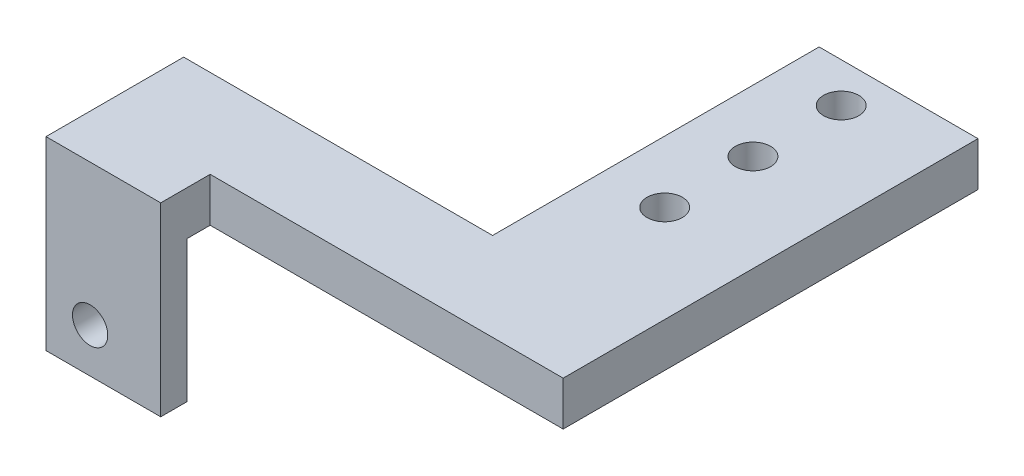
ISO-10303-21;
HEADER;
FILE_DESCRIPTION(('STEP AP214'),'2;1');
FILE_NAME('part.step','',(''),(''),'','','');
FILE_SCHEMA(('AUTOMOTIVE_DESIGN { 1 0 10303 214 1 1 1 1 }'));
ENDSEC;
DATA;
#1=APPLICATION_CONTEXT('core data for automotive mechanical design processes');
#2=APPLICATION_PROTOCOL_DEFINITION('international standard','automotive_design',2000,#1);
#3=PRODUCT_CONTEXT('',#1,'mechanical');
#4=PRODUCT('Part','Part','',(#3));
#5=PRODUCT_RELATED_PRODUCT_CATEGORY('part','',(#4));
#6=PRODUCT_DEFINITION_FORMATION('','',#4);
#7=PRODUCT_DEFINITION_CONTEXT('part definition',#1,'design');
#8=PRODUCT_DEFINITION('design','',#6,#7);
#9=PRODUCT_DEFINITION_SHAPE('','',#8);
#10=(LENGTH_UNIT() NAMED_UNIT(*) SI_UNIT(.MILLI.,.METRE.));
#11=(NAMED_UNIT(*) PLANE_ANGLE_UNIT() SI_UNIT($,.RADIAN.));
#12=(NAMED_UNIT(*) SI_UNIT($,.STERADIAN.) SOLID_ANGLE_UNIT());
#13=UNCERTAINTY_MEASURE_WITH_UNIT(LENGTH_MEASURE(1.E-05),#10,'distance_accuracy_value','');
#14=(GEOMETRIC_REPRESENTATION_CONTEXT(3) GLOBAL_UNCERTAINTY_ASSIGNED_CONTEXT((#13)) GLOBAL_UNIT_ASSIGNED_CONTEXT((#10,
#11,#12)) REPRESENTATION_CONTEXT('',''));
#15=CARTESIAN_POINT('',(0.,0.,0.));
#16=DIRECTION('',(0.,0.,1.));
#17=DIRECTION('',(1.,0.,0.));
#18=AXIS2_PLACEMENT_3D('',#15,#16,#17);
#19=CARTESIAN_POINT('',(0.,0.,0.));
#20=DIRECTION('',(0.,1.,0.));
#21=DIRECTION('',(0.,0.,1.));
#22=AXIS2_PLACEMENT_3D('',#19,#20,#21);
#23=PLANE('',#22);
#24=CARTESIAN_POINT('',(16.5,0.,-31.3394531545482));
#25=DIRECTION('',(0.,1.,0.));
#26=DIRECTION('',(0.,0.,1.));
#27=AXIS2_PLACEMENT_3D('',#24,#25,#26);
#28=CIRCLE('',#27,2.);
#29=CARTESIAN_POINT('',(16.5,0.,-29.3394531545482));
#30=VERTEX_POINT('',#29);
#31=EDGE_CURVE('E244',#30,#30,#28,.T.);
#32=ORIENTED_EDGE('',*,*,#31,.T.);
#33=EDGE_LOOP('',(#32));
#34=FACE_BOUND('',#33,.T.);
#35=CARTESIAN_POINT('',(16.5,0.,-21.3394531545482));
#36=DIRECTION('',(0.,1.,0.));
#37=DIRECTION('',(0.,0.,1.));
#38=AXIS2_PLACEMENT_3D('',#35,#36,#37);
#39=CIRCLE('',#38,2.);
#40=CARTESIAN_POINT('',(16.5,0.,-19.3394531545482));
#41=VERTEX_POINT('',#40);
#42=EDGE_CURVE('E249',#41,#41,#39,.T.);
#43=ORIENTED_EDGE('',*,*,#42,.T.);
#44=EDGE_LOOP('',(#43));
#45=FACE_BOUND('',#44,.T.);
#46=CARTESIAN_POINT('',(16.5,0.,-11.3394531545482));
#47=DIRECTION('',(0.,1.,0.));
#48=DIRECTION('',(0.,0.,1.));
#49=AXIS2_PLACEMENT_3D('',#46,#47,#48);
#50=CIRCLE('',#49,2.);
#51=CARTESIAN_POINT('',(16.5,0.,-9.33945315454823));
#52=VERTEX_POINT('',#51);
#53=EDGE_CURVE('E255',#52,#52,#50,.T.);
#54=ORIENTED_EDGE('',*,*,#53,.T.);
#55=EDGE_LOOP('',(#54));
#56=FACE_BOUND('',#55,.T.);
#57=DIRECTION('',(1.,0.,0.));
#58=VECTOR('',#57,1.);
#59=CARTESIAN_POINT('',(-12.5,0.,13.7605468454518));
#60=LINE('',#59,#58);
#61=CARTESIAN_POINT('',(-25.5,0.,13.7605468454518));
#62=VERTEX_POINT('',#61);
#63=CARTESIAN_POINT('',(-12.5,0.,13.7605468454518));
#64=VERTEX_POINT('',#63);
#65=EDGE_CURVE('E55',#62,#64,#60,.T.);
#66=ORIENTED_EDGE('',*,*,#65,.F.);
#67=DIRECTION('',(0.,0.,1.));
#68=VECTOR('',#67,1.);
#69=CARTESIAN_POINT('',(-25.5,0.,16.7605468454518));
#70=LINE('',#69,#68);
#71=CARTESIAN_POINT('',(-25.5,0.,1.16054684545176));
#72=VERTEX_POINT('',#71);
#73=EDGE_CURVE('E158',#72,#62,#70,.T.);
#74=ORIENTED_EDGE('',*,*,#73,.F.);
#75=DIRECTION('',(-1.,0.,0.));
#76=VECTOR('',#75,1.);
#77=CARTESIAN_POINT('',(-25.5,0.,1.16054684545176));
#78=LINE('',#77,#76);
#79=CARTESIAN_POINT('',(9.49999999999998,0.,1.16054684545177));
#80=VERTEX_POINT('',#79);
#81=EDGE_CURVE('E155',#80,#72,#78,.T.);
#82=ORIENTED_EDGE('',*,*,#81,.F.);
#83=DIRECTION('',(0.,0.,1.));
#84=VECTOR('',#83,1.);
#85=CARTESIAN_POINT('',(9.49999999999998,0.,-35.8394531545482));
#86=LINE('',#85,#84);
#87=CARTESIAN_POINT('',(9.49999999999998,0.,-35.8394531545482));
#88=VERTEX_POINT('',#87);
#89=EDGE_CURVE('E151',#88,#80,#86,.T.);
#90=ORIENTED_EDGE('',*,*,#89,.F.);
#91=DIRECTION('',(-1.,0.,0.));
#92=VECTOR('',#91,1.);
#93=CARTESIAN_POINT('',(27.5,0.,-35.8394531545482));
#94=LINE('',#93,#92);
#95=CARTESIAN_POINT('',(27.5,0.,-35.8394531545482));
#96=VERTEX_POINT('',#95);
#97=EDGE_CURVE('E147',#96,#88,#94,.T.);
#98=ORIENTED_EDGE('',*,*,#97,.F.);
#99=DIRECTION('',(0.,0.,-1.));
#100=VECTOR('',#99,1.);
#101=CARTESIAN_POINT('',(27.5,0.,11.1605468454518));
#102=LINE('',#101,#100);
#103=CARTESIAN_POINT('',(27.5,0.,11.1605468454518));
#104=VERTEX_POINT('',#103);
#105=EDGE_CURVE('E91',#104,#96,#102,.T.);
#106=ORIENTED_EDGE('',*,*,#105,.F.);
#107=DIRECTION('',(1.,0.,0.));
#108=VECTOR('',#107,1.);
#109=CARTESIAN_POINT('',(27.5,0.,11.1605468454518));
#110=LINE('',#109,#108);
#111=CARTESIAN_POINT('',(-12.5,0.,11.1605468454518));
#112=VERTEX_POINT('',#111);
#113=EDGE_CURVE('E163',#112,#104,#110,.T.);
#114=ORIENTED_EDGE('',*,*,#113,.F.);
#115=DIRECTION('',(0.,0.,-1.));
#116=VECTOR('',#115,1.);
#117=CARTESIAN_POINT('',(-12.5,0.,11.1605468454518));
#118=LINE('',#117,#116);
#119=EDGE_CURVE('E132',#64,#112,#118,.T.);
#120=ORIENTED_EDGE('',*,*,#119,.F.);
#121=EDGE_LOOP('',(#66,#74,#82,#90,#98,#106,#114,#120));
#122=FACE_BOUND('',#121,.T.);
#123=ADVANCED_FACE('F39',(#34,#45,#56,#122),#23,.F.);
#124=CARTESIAN_POINT('',(27.5,5.,-35.8394531545482));
#125=DIRECTION('',(0.,0.,1.));
#126=DIRECTION('',(1.,0.,0.));
#127=AXIS2_PLACEMENT_3D('',#124,#125,#126);
#128=PLANE('',#127);
#129=ORIENTED_EDGE('',*,*,#97,.T.);
#130=DIRECTION('',(0.,-1.,0.));
#131=VECTOR('',#130,1.);
#132=CARTESIAN_POINT('',(9.49999999999998,5.,-35.8394531545482));
#133=LINE('',#132,#131);
#134=CARTESIAN_POINT('',(9.49999999999998,5.,-35.8394531545482));
#135=VERTEX_POINT('',#134);
#136=EDGE_CURVE('E11',#135,#88,#133,.T.);
#137=ORIENTED_EDGE('',*,*,#136,.F.);
#138=DIRECTION('',(-1.,0.,0.));
#139=VECTOR('',#138,1.);
#140=CARTESIAN_POINT('',(27.5,5.,-35.8394531545482));
#141=LINE('',#140,#139);
#142=CARTESIAN_POINT('',(27.5,5.,-35.8394531545482));
#143=VERTEX_POINT('',#142);
#144=EDGE_CURVE('E168',#143,#135,#141,.T.);
#145=ORIENTED_EDGE('',*,*,#144,.F.);
#146=DIRECTION('',(0.,-1.,0.));
#147=VECTOR('',#146,1.);
#148=CARTESIAN_POINT('',(27.5,5.,-35.8394531545482));
#149=LINE('',#148,#147);
#150=EDGE_CURVE('E143',#143,#96,#149,.T.);
#151=ORIENTED_EDGE('',*,*,#150,.T.);
#152=EDGE_LOOP('',(#129,#137,#145,#151));
#153=FACE_BOUND('',#152,.T.);
#154=ADVANCED_FACE('F41',(#153),#128,.F.);
#155=CARTESIAN_POINT('',(9.49999999999998,5.,-35.8394531545482));
#156=DIRECTION('',(1.,0.,0.));
#157=DIRECTION('',(0.,0.,-1.));
#158=AXIS2_PLACEMENT_3D('',#155,#156,#157);
#159=PLANE('',#158);
#160=ORIENTED_EDGE('',*,*,#89,.T.);
#161=DIRECTION('',(0.,-1.,0.));
#162=VECTOR('',#161,1.);
#163=CARTESIAN_POINT('',(9.49999999999998,5.,1.16054684545177));
#164=LINE('',#163,#162);
#165=CARTESIAN_POINT('',(9.49999999999998,5.,1.16054684545177));
#166=VERTEX_POINT('',#165);
#167=EDGE_CURVE('E48',#166,#80,#164,.T.);
#168=ORIENTED_EDGE('',*,*,#167,.F.);
#169=DIRECTION('',(0.,0.,1.));
#170=VECTOR('',#169,1.);
#171=CARTESIAN_POINT('',(9.49999999999998,5.,-35.8394531545482));
#172=LINE('',#171,#170);
#173=EDGE_CURVE('E99',#135,#166,#172,.T.);
#174=ORIENTED_EDGE('',*,*,#173,.F.);
#175=ORIENTED_EDGE('',*,*,#136,.T.);
#176=EDGE_LOOP('',(#160,#168,#174,#175));
#177=FACE_BOUND('',#176,.T.);
#178=ADVANCED_FACE('F302',(#177),#159,.F.);
#179=CARTESIAN_POINT('',(-25.5,5.,1.16054684545176));
#180=DIRECTION('',(0.,0.,1.));
#181=DIRECTION('',(1.,0.,0.));
#182=AXIS2_PLACEMENT_3D('',#179,#180,#181);
#183=PLANE('',#182);
#184=ORIENTED_EDGE('',*,*,#81,.T.);
#185=DIRECTION('',(0.,-1.,0.));
#186=VECTOR('',#185,1.);
#187=CARTESIAN_POINT('',(-25.5,5.,1.16054684545176));
#188=LINE('',#187,#186);
#189=CARTESIAN_POINT('',(-25.5,5.,1.16054684545176));
#190=VERTEX_POINT('',#189);
#191=EDGE_CURVE('E179',#190,#72,#188,.T.);
#192=ORIENTED_EDGE('',*,*,#191,.F.);
#193=DIRECTION('',(-1.,0.,0.));
#194=VECTOR('',#193,1.);
#195=CARTESIAN_POINT('',(-25.5,5.,1.16054684545176));
#196=LINE('',#195,#194);
#197=EDGE_CURVE('E189',#166,#190,#196,.T.);
#198=ORIENTED_EDGE('',*,*,#197,.F.);
#199=ORIENTED_EDGE('',*,*,#167,.T.);
#200=EDGE_LOOP('',(#184,#192,#198,#199));
#201=FACE_BOUND('',#200,.T.);
#202=ADVANCED_FACE('F187',(#201),#183,.F.);
#203=CARTESIAN_POINT('',(-25.5,5.,16.7605468454518));
#204=DIRECTION('',(1.,0.,0.));
#205=DIRECTION('',(0.,0.,-1.));
#206=AXIS2_PLACEMENT_3D('',#203,#204,#205);
#207=PLANE('',#206);
#208=ORIENTED_EDGE('',*,*,#73,.T.);
#209=DIRECTION('',(0.,1.,0.));
#210=VECTOR('',#209,1.);
#211=CARTESIAN_POINT('',(-25.5,-16.,13.7605468454518));
#212=LINE('',#211,#210);
#213=CARTESIAN_POINT('',(-25.5,-16.,13.7605468454518));
#214=VERTEX_POINT('',#213);
#215=EDGE_CURVE('E152',#214,#62,#212,.T.);
#216=ORIENTED_EDGE('',*,*,#215,.F.);
#217=DIRECTION('',(0.,0.,-1.));
#218=VECTOR('',#217,1.);
#219=CARTESIAN_POINT('',(-25.5,-16.,16.7605468454518));
#220=LINE('',#219,#218);
#221=CARTESIAN_POINT('',(-25.5,-16.,16.7605468454518));
#222=VERTEX_POINT('',#221);
#223=EDGE_CURVE('E223',#222,#214,#220,.T.);
#224=ORIENTED_EDGE('',*,*,#223,.F.);
#225=DIRECTION('',(0.,-1.,0.));
#226=VECTOR('',#225,1.);
#227=CARTESIAN_POINT('',(-25.5,5.,16.7605468454518));
#228=LINE('',#227,#226);
#229=CARTESIAN_POINT('',(-25.5,5.,16.7605468454518));
#230=VERTEX_POINT('',#229);
#231=EDGE_CURVE('E175',#230,#222,#228,.T.);
#232=ORIENTED_EDGE('',*,*,#231,.F.);
#233=DIRECTION('',(0.,0.,1.));
#234=VECTOR('',#233,1.);
#235=CARTESIAN_POINT('',(-25.5,5.,16.7605468454518));
#236=LINE('',#235,#234);
#237=EDGE_CURVE('E217',#190,#230,#236,.T.);
#238=ORIENTED_EDGE('',*,*,#237,.F.);
#239=ORIENTED_EDGE('',*,*,#191,.T.);
#240=EDGE_LOOP('',(#208,#216,#224,#232,#238,#239));
#241=FACE_BOUND('',#240,.T.);
#242=ADVANCED_FACE('F194',(#241),#207,.F.);
#243=CARTESIAN_POINT('',(-12.5,5.,16.7605468454518));
#244=DIRECTION('',(0.,0.,-1.));
#245=DIRECTION('',(-1.,0.,0.));
#246=AXIS2_PLACEMENT_3D('',#243,#244,#245);
#247=PLANE('',#246);
#248=CARTESIAN_POINT('',(-20.5,-11.,16.7605468454518));
#249=DIRECTION('',(0.,0.,-1.));
#250=DIRECTION('',(-1.,0.,0.));
#251=AXIS2_PLACEMENT_3D('',#248,#249,#250);
#252=CIRCLE('',#251,2.);
#253=CARTESIAN_POINT('',(-22.5,-11.,16.7605468454518));
#254=VERTEX_POINT('',#253);
#255=EDGE_CURVE('E268',#254,#254,#252,.T.);
#256=ORIENTED_EDGE('',*,*,#255,.T.);
#257=EDGE_LOOP('',(#256));
#258=FACE_BOUND('',#257,.T.);
#259=ORIENTED_EDGE('',*,*,#231,.T.);
#260=DIRECTION('',(-1.,0.,0.));
#261=VECTOR('',#260,1.);
#262=CARTESIAN_POINT('',(-12.5,-16.,16.7605468454518));
#263=LINE('',#262,#261);
#264=CARTESIAN_POINT('',(-12.5,-16.,16.7605468454518));
#265=VERTEX_POINT('',#264);
#266=EDGE_CURVE('E229',#265,#222,#263,.T.);
#267=ORIENTED_EDGE('',*,*,#266,.F.);
#268=DIRECTION('',(0.,-1.,0.));
#269=VECTOR('',#268,1.);
#270=CARTESIAN_POINT('',(-12.5,5.,16.7605468454518));
#271=LINE('',#270,#269);
#272=CARTESIAN_POINT('',(-12.5,5.,16.7605468454518));
#273=VERTEX_POINT('',#272);
#274=EDGE_CURVE('E136',#273,#265,#271,.T.);
#275=ORIENTED_EDGE('',*,*,#274,.F.);
#276=DIRECTION('',(1.,0.,0.));
#277=VECTOR('',#276,1.);
#278=CARTESIAN_POINT('',(-12.5,5.,16.7605468454518));
#279=LINE('',#278,#277);
#280=EDGE_CURVE('E122',#230,#273,#279,.T.);
#281=ORIENTED_EDGE('',*,*,#280,.F.);
#282=EDGE_LOOP('',(#259,#267,#275,#281));
#283=FACE_BOUND('',#282,.T.);
#284=ADVANCED_FACE('F227',(#258,#283),#247,.F.);
#285=CARTESIAN_POINT('',(-12.5,5.,11.1605468454518));
#286=DIRECTION('',(-1.,0.,0.));
#287=DIRECTION('',(0.,0.,1.));
#288=AXIS2_PLACEMENT_3D('',#285,#286,#287);
#289=PLANE('',#288);
#290=ORIENTED_EDGE('',*,*,#274,.T.);
#291=DIRECTION('',(0.,0.,1.));
#292=VECTOR('',#291,1.);
#293=CARTESIAN_POINT('',(-12.5,-16.,16.7605468454518));
#294=LINE('',#293,#292);
#295=CARTESIAN_POINT('',(-12.5,-16.,13.7605468454518));
#296=VERTEX_POINT('',#295);
#297=EDGE_CURVE('E232',#296,#265,#294,.T.);
#298=ORIENTED_EDGE('',*,*,#297,.F.);
#299=DIRECTION('',(0.,1.,0.));
#300=VECTOR('',#299,1.);
#301=CARTESIAN_POINT('',(-12.5,-16.,13.7605468454518));
#302=LINE('',#301,#300);
#303=EDGE_CURVE('E205',#296,#64,#302,.T.);
#304=ORIENTED_EDGE('',*,*,#303,.T.);
#305=ORIENTED_EDGE('',*,*,#119,.T.);
#306=DIRECTION('',(0.,-1.,0.));
#307=VECTOR('',#306,1.);
#308=CARTESIAN_POINT('',(-12.5,5.,11.1605468454518));
#309=LINE('',#308,#307);
#310=CARTESIAN_POINT('',(-12.5,5.,11.1605468454518));
#311=VERTEX_POINT('',#310);
#312=EDGE_CURVE('E129',#311,#112,#309,.T.);
#313=ORIENTED_EDGE('',*,*,#312,.F.);
#314=DIRECTION('',(0.,0.,-1.));
#315=VECTOR('',#314,1.);
#316=CARTESIAN_POINT('',(-12.5,5.,11.1605468454518));
#317=LINE('',#316,#315);
#318=EDGE_CURVE('E115',#273,#311,#317,.T.);
#319=ORIENTED_EDGE('',*,*,#318,.F.);
#320=EDGE_LOOP('',(#290,#298,#304,#305,#313,#319));
#321=FACE_BOUND('',#320,.T.);
#322=ADVANCED_FACE('F130',(#321),#289,.F.);
#323=CARTESIAN_POINT('',(27.5,5.,11.1605468454518));
#324=DIRECTION('',(0.,0.,-1.));
#325=DIRECTION('',(-1.,0.,0.));
#326=AXIS2_PLACEMENT_3D('',#323,#324,#325);
#327=PLANE('',#326);
#328=ORIENTED_EDGE('',*,*,#113,.T.);
#329=DIRECTION('',(0.,-1.,0.));
#330=VECTOR('',#329,1.);
#331=CARTESIAN_POINT('',(27.5,5.,11.1605468454518));
#332=LINE('',#331,#330);
#333=CARTESIAN_POINT('',(27.5,5.,11.1605468454518));
#334=VERTEX_POINT('',#333);
#335=EDGE_CURVE('E137',#334,#104,#332,.T.);
#336=ORIENTED_EDGE('',*,*,#335,.F.);
#337=DIRECTION('',(1.,0.,0.));
#338=VECTOR('',#337,1.);
#339=CARTESIAN_POINT('',(27.5,5.,11.1605468454518));
#340=LINE('',#339,#338);
#341=EDGE_CURVE('E119',#311,#334,#340,.T.);
#342=ORIENTED_EDGE('',*,*,#341,.F.);
#343=ORIENTED_EDGE('',*,*,#312,.T.);
#344=EDGE_LOOP('',(#328,#336,#342,#343));
#345=FACE_BOUND('',#344,.T.);
#346=ADVANCED_FACE('F139',(#345),#327,.F.);
#347=CARTESIAN_POINT('',(27.5,5.,11.1605468454518));
#348=DIRECTION('',(-1.,0.,0.));
#349=DIRECTION('',(0.,0.,1.));
#350=AXIS2_PLACEMENT_3D('',#347,#348,#349);
#351=PLANE('',#350);
#352=ORIENTED_EDGE('',*,*,#105,.T.);
#353=ORIENTED_EDGE('',*,*,#150,.F.);
#354=DIRECTION('',(0.,0.,-1.));
#355=VECTOR('',#354,1.);
#356=CARTESIAN_POINT('',(27.5,5.,11.1605468454518));
#357=LINE('',#356,#355);
#358=EDGE_CURVE('E64',#334,#143,#357,.T.);
#359=ORIENTED_EDGE('',*,*,#358,.F.);
#360=ORIENTED_EDGE('',*,*,#335,.T.);
#361=EDGE_LOOP('',(#352,#353,#359,#360));
#362=FACE_BOUND('',#361,.T.);
#363=ADVANCED_FACE('F294',(#362),#351,.F.);
#364=CARTESIAN_POINT('',(0.,5.,0.));
#365=DIRECTION('',(0.,1.,0.));
#366=DIRECTION('',(0.,0.,1.));
#367=AXIS2_PLACEMENT_3D('',#364,#365,#366);
#368=PLANE('',#367);
#369=CARTESIAN_POINT('',(16.5,5.,-31.3394531545482));
#370=DIRECTION('',(0.,1.,0.));
#371=DIRECTION('',(0.,0.,1.));
#372=AXIS2_PLACEMENT_3D('',#369,#370,#371);
#373=CIRCLE('',#372,2.);
#374=CARTESIAN_POINT('',(16.5,5.,-29.3394531545482));
#375=VERTEX_POINT('',#374);
#376=EDGE_CURVE('E262',#375,#375,#373,.T.);
#377=ORIENTED_EDGE('',*,*,#376,.F.);
#378=EDGE_LOOP('',(#377));
#379=FACE_BOUND('',#378,.T.);
#380=CARTESIAN_POINT('',(16.5,5.,-21.3394531545482));
#381=DIRECTION('',(0.,1.,0.));
#382=DIRECTION('',(0.,0.,1.));
#383=AXIS2_PLACEMENT_3D('',#380,#381,#382);
#384=CIRCLE('',#383,2.);
#385=CARTESIAN_POINT('',(16.5,5.,-19.3394531545482));
#386=VERTEX_POINT('',#385);
#387=EDGE_CURVE('E267',#386,#386,#384,.T.);
#388=ORIENTED_EDGE('',*,*,#387,.F.);
#389=EDGE_LOOP('',(#388));
#390=FACE_BOUND('',#389,.T.);
#391=CARTESIAN_POINT('',(16.5,5.,-11.3394531545482));
#392=DIRECTION('',(0.,1.,0.));
#393=DIRECTION('',(0.,0.,1.));
#394=AXIS2_PLACEMENT_3D('',#391,#392,#393);
#395=CIRCLE('',#394,2.);
#396=CARTESIAN_POINT('',(16.5,5.,-9.33945315454823));
#397=VERTEX_POINT('',#396);
#398=EDGE_CURVE('E263',#397,#397,#395,.T.);
#399=ORIENTED_EDGE('',*,*,#398,.F.);
#400=EDGE_LOOP('',(#399));
#401=FACE_BOUND('',#400,.T.);
#402=ORIENTED_EDGE('',*,*,#144,.T.);
#403=ORIENTED_EDGE('',*,*,#173,.T.);
#404=ORIENTED_EDGE('',*,*,#197,.T.);
#405=ORIENTED_EDGE('',*,*,#237,.T.);
#406=ORIENTED_EDGE('',*,*,#280,.T.);
#407=ORIENTED_EDGE('',*,*,#318,.T.);
#408=ORIENTED_EDGE('',*,*,#341,.T.);
#409=ORIENTED_EDGE('',*,*,#358,.T.);
#410=EDGE_LOOP('',(#402,#403,#404,#405,#406,#407,#408,#409));
#411=FACE_BOUND('',#410,.T.);
#412=ADVANCED_FACE('F117',(#379,#390,#401,#411),#368,.T.);
#413=CARTESIAN_POINT('',(-12.5,-16.,13.7605468454518));
#414=DIRECTION('',(0.,0.,1.));
#415=DIRECTION('',(1.,0.,0.));
#416=AXIS2_PLACEMENT_3D('',#413,#414,#415);
#417=PLANE('',#416);
#418=CARTESIAN_POINT('',(-20.5,-11.,13.7605468454518));
#419=DIRECTION('',(0.,0.,-1.));
#420=DIRECTION('',(-1.,0.,0.));
#421=AXIS2_PLACEMENT_3D('',#418,#419,#420);
#422=CIRCLE('',#421,2.);
#423=CARTESIAN_POINT('',(-22.5,-11.,13.7605468454518));
#424=VERTEX_POINT('',#423);
#425=EDGE_CURVE('E278',#424,#424,#422,.T.);
#426=ORIENTED_EDGE('',*,*,#425,.F.);
#427=EDGE_LOOP('',(#426));
#428=FACE_BOUND('',#427,.T.);
#429=ORIENTED_EDGE('',*,*,#65,.T.);
#430=ORIENTED_EDGE('',*,*,#303,.F.);
#431=DIRECTION('',(1.,0.,0.));
#432=VECTOR('',#431,1.);
#433=CARTESIAN_POINT('',(-12.5,-16.,13.7605468454518));
#434=LINE('',#433,#432);
#435=EDGE_CURVE('E203',#214,#296,#434,.T.);
#436=ORIENTED_EDGE('',*,*,#435,.F.);
#437=ORIENTED_EDGE('',*,*,#215,.T.);
#438=EDGE_LOOP('',(#429,#430,#436,#437));
#439=FACE_BOUND('',#438,.T.);
#440=ADVANCED_FACE('F200',(#428,#439),#417,.F.);
#441=CARTESIAN_POINT('',(0.,-16.,0.));
#442=DIRECTION('',(0.,1.,0.));
#443=DIRECTION('',(0.,0.,1.));
#444=AXIS2_PLACEMENT_3D('',#441,#442,#443);
#445=PLANE('',#444);
#446=ORIENTED_EDGE('',*,*,#297,.T.);
#447=ORIENTED_EDGE('',*,*,#266,.T.);
#448=ORIENTED_EDGE('',*,*,#223,.T.);
#449=ORIENTED_EDGE('',*,*,#435,.T.);
#450=EDGE_LOOP('',(#446,#447,#448,#449));
#451=FACE_BOUND('',#450,.T.);
#452=ADVANCED_FACE('F237',(#451),#445,.F.);
#453=CARTESIAN_POINT('',(16.5,-11.,-11.3394531545482));
#454=DIRECTION('',(0.,1.,0.));
#455=DIRECTION('',(0.,0.,1.));
#456=AXIS2_PLACEMENT_3D('',#453,#454,#455);
#457=CYLINDRICAL_SURFACE('',#456,2.);
#458=ORIENTED_EDGE('',*,*,#398,.T.);
#459=EDGE_LOOP('',(#458));
#460=FACE_BOUND('',#459,.T.);
#461=ORIENTED_EDGE('',*,*,#53,.F.);
#462=EDGE_LOOP('',(#461));
#463=FACE_BOUND('',#462,.T.);
#464=ADVANCED_FACE('F292',(#460,#463),#457,.F.);
#465=CARTESIAN_POINT('',(16.5,-11.,-21.3394531545482));
#466=DIRECTION('',(0.,1.,0.));
#467=DIRECTION('',(0.,0.,1.));
#468=AXIS2_PLACEMENT_3D('',#465,#466,#467);
#469=CYLINDRICAL_SURFACE('',#468,2.);
#470=ORIENTED_EDGE('',*,*,#387,.T.);
#471=EDGE_LOOP('',(#470));
#472=FACE_BOUND('',#471,.T.);
#473=ORIENTED_EDGE('',*,*,#42,.F.);
#474=EDGE_LOOP('',(#473));
#475=FACE_BOUND('',#474,.T.);
#476=ADVANCED_FACE('F366',(#472,#475),#469,.F.);
#477=CARTESIAN_POINT('',(16.5,-11.,-31.3394531545482));
#478=DIRECTION('',(0.,1.,0.));
#479=DIRECTION('',(0.,0.,1.));
#480=AXIS2_PLACEMENT_3D('',#477,#478,#479);
#481=CYLINDRICAL_SURFACE('',#480,2.);
#482=ORIENTED_EDGE('',*,*,#376,.T.);
#483=EDGE_LOOP('',(#482));
#484=FACE_BOUND('',#483,.T.);
#485=ORIENTED_EDGE('',*,*,#31,.F.);
#486=EDGE_LOOP('',(#485));
#487=FACE_BOUND('',#486,.T.);
#488=ADVANCED_FACE('F376',(#484,#487),#481,.F.);
#489=CARTESIAN_POINT('',(-20.5,-11.,29.7605468454518));
#490=DIRECTION('',(0.,0.,-1.));
#491=DIRECTION('',(-1.,0.,0.));
#492=AXIS2_PLACEMENT_3D('',#489,#490,#491);
#493=CYLINDRICAL_SURFACE('',#492,2.);
#494=ORIENTED_EDGE('',*,*,#425,.T.);
#495=EDGE_LOOP('',(#494));
#496=FACE_BOUND('',#495,.T.);
#497=ORIENTED_EDGE('',*,*,#255,.F.);
#498=EDGE_LOOP('',(#497));
#499=FACE_BOUND('',#498,.T.);
#500=ADVANCED_FACE('F283',(#496,#499),#493,.F.);
#501=CLOSED_SHELL('',(#123,#154,#178,#202,#242,#284,#322,#346,#363,#412,#440,#452,#464,#476,
#488,#500));
#502=MANIFOLD_SOLID_BREP('B2',#501);
#503=ADVANCED_BREP_SHAPE_REPRESENTATION('',(#18,#502),#14);
#504=SHAPE_DEFINITION_REPRESENTATION(#9,#503);
ENDSEC;
END-ISO-10303-21;
